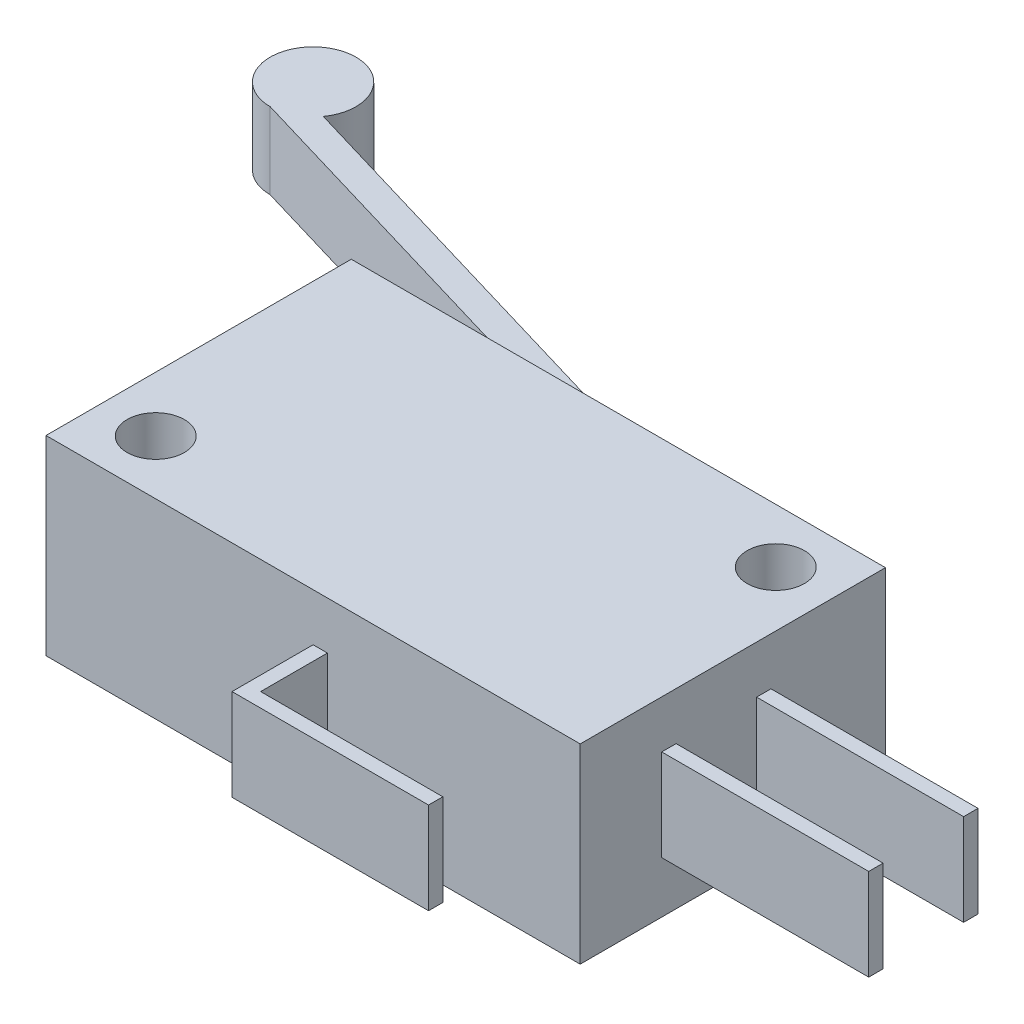
ISO-10303-21;
HEADER;
FILE_DESCRIPTION(('STEP AP214'),'2;1');
FILE_NAME('part.step','',(''),(''),'','','');
FILE_SCHEMA(('AUTOMOTIVE_DESIGN { 1 0 10303 214 1 1 1 1 }'));
ENDSEC;
DATA;
#1=APPLICATION_CONTEXT('core data for automotive mechanical design processes');
#2=APPLICATION_PROTOCOL_DEFINITION('international standard','automotive_design',2000,#1);
#3=PRODUCT_CONTEXT('',#1,'mechanical');
#4=PRODUCT('Part','Part','',(#3));
#5=PRODUCT_RELATED_PRODUCT_CATEGORY('part','',(#4));
#6=PRODUCT_DEFINITION_FORMATION('','',#4);
#7=PRODUCT_DEFINITION_CONTEXT('part definition',#1,'design');
#8=PRODUCT_DEFINITION('design','',#6,#7);
#9=PRODUCT_DEFINITION_SHAPE('','',#8);
#10=(LENGTH_UNIT() NAMED_UNIT(*) SI_UNIT(.MILLI.,.METRE.));
#11=(NAMED_UNIT(*) PLANE_ANGLE_UNIT() SI_UNIT($,.RADIAN.));
#12=(NAMED_UNIT(*) SI_UNIT($,.STERADIAN.) SOLID_ANGLE_UNIT());
#13=UNCERTAINTY_MEASURE_WITH_UNIT(LENGTH_MEASURE(1.E-05),#10,'distance_accuracy_value','');
#14=(GEOMETRIC_REPRESENTATION_CONTEXT(3) GLOBAL_UNCERTAINTY_ASSIGNED_CONTEXT((#13)) GLOBAL_UNIT_ASSIGNED_CONTEXT((#10,
#11,#12)) REPRESENTATION_CONTEXT('',''));
#15=CARTESIAN_POINT('',(0.,0.,0.));
#16=DIRECTION('',(0.,0.,1.));
#17=DIRECTION('',(1.,0.,0.));
#18=AXIS2_PLACEMENT_3D('',#15,#16,#17);
#19=CARTESIAN_POINT('',(0.,10.,0.));
#20=DIRECTION('',(0.,0.,-1.));
#21=DIRECTION('',(-1.,0.,0.));
#22=AXIS2_PLACEMENT_3D('',#19,#20,#21);
#23=PLANE('',#22);
#24=DIRECTION('',(1.,0.,0.));
#25=VECTOR('',#24,1.);
#26=CARTESIAN_POINT('',(0.,0.,0.));
#27=LINE('',#26,#25);
#28=CARTESIAN_POINT('',(0.,0.,0.));
#29=VERTEX_POINT('',#28);
#30=CARTESIAN_POINT('',(28.,0.,0.));
#31=VERTEX_POINT('',#30);
#32=EDGE_CURVE('E489',#29,#31,#27,.T.);
#33=ORIENTED_EDGE('',*,*,#32,.F.);
#34=DIRECTION('',(0.,-1.,0.));
#35=VECTOR('',#34,1.);
#36=CARTESIAN_POINT('',(0.,10.,0.));
#37=LINE('',#36,#35);
#38=CARTESIAN_POINT('',(0.,10.,0.));
#39=VERTEX_POINT('',#38);
#40=EDGE_CURVE('E78',#39,#29,#37,.T.);
#41=ORIENTED_EDGE('',*,*,#40,.F.);
#42=DIRECTION('',(1.,0.,0.));
#43=VECTOR('',#42,1.);
#44=CARTESIAN_POINT('',(0.,10.,0.));
#45=LINE('',#44,#43);
#46=CARTESIAN_POINT('',(28.,10.,0.));
#47=VERTEX_POINT('',#46);
#48=EDGE_CURVE('E472',#39,#47,#45,.T.);
#49=ORIENTED_EDGE('',*,*,#48,.T.);
#50=DIRECTION('',(0.,-1.,0.));
#51=VECTOR('',#50,1.);
#52=CARTESIAN_POINT('',(28.,10.,0.));
#53=LINE('',#52,#51);
#54=EDGE_CURVE('E12',#47,#31,#53,.T.);
#55=ORIENTED_EDGE('',*,*,#54,.T.);
#56=EDGE_LOOP('',(#33,#41,#49,#55));
#57=FACE_BOUND('',#56,.T.);
#58=DIRECTION('',(0.,-1.,0.));
#59=VECTOR('',#58,1.);
#60=CARTESIAN_POINT('',(14.,7.1,0.));
#61=LINE('',#60,#59);
#62=CARTESIAN_POINT('',(14.,7.1,0.));
#63=VERTEX_POINT('',#62);
#64=CARTESIAN_POINT('',(14.,3.1,0.));
#65=VERTEX_POINT('',#64);
#66=EDGE_CURVE('E456',#63,#65,#61,.T.);
#67=ORIENTED_EDGE('',*,*,#66,.T.);
#68=DIRECTION('',(1.,0.,0.));
#69=VECTOR('',#68,1.);
#70=CARTESIAN_POINT('',(0.,3.1,0.));
#71=LINE('',#70,#69);
#72=CARTESIAN_POINT('',(15.43,3.1,0.));
#73=VERTEX_POINT('',#72);
#74=EDGE_CURVE('E415',#65,#73,#71,.T.);
#75=ORIENTED_EDGE('',*,*,#74,.T.);
#76=DIRECTION('',(0.,-1.,0.));
#77=VECTOR('',#76,1.);
#78=CARTESIAN_POINT('',(15.43,7.1,0.));
#79=LINE('',#78,#77);
#80=CARTESIAN_POINT('',(15.43,7.1,0.));
#81=VERTEX_POINT('',#80);
#82=EDGE_CURVE('E453',#81,#73,#79,.T.);
#83=ORIENTED_EDGE('',*,*,#82,.F.);
#84=DIRECTION('',(1.,0.,0.));
#85=VECTOR('',#84,1.);
#86=CARTESIAN_POINT('',(0.,7.1,0.));
#87=LINE('',#86,#85);
#88=EDGE_CURVE('E384',#63,#81,#87,.T.);
#89=ORIENTED_EDGE('',*,*,#88,.F.);
#90=EDGE_LOOP('',(#67,#75,#83,#89));
#91=FACE_BOUND('',#90,.T.);
#92=DIRECTION('',(0.,-1.,0.));
#93=VECTOR('',#92,1.);
#94=CARTESIAN_POINT('',(4.25,7.1,0.));
#95=LINE('',#94,#93);
#96=CARTESIAN_POINT('',(4.25,7.1,0.));
#97=VERTEX_POINT('',#96);
#98=CARTESIAN_POINT('',(4.25,3.1,0.));
#99=VERTEX_POINT('',#98);
#100=EDGE_CURVE('E439',#97,#99,#95,.T.);
#101=ORIENTED_EDGE('',*,*,#100,.T.);
#102=DIRECTION('',(1.,0.,0.));
#103=VECTOR('',#102,1.);
#104=CARTESIAN_POINT('',(0.,3.1,0.));
#105=LINE('',#104,#103);
#106=CARTESIAN_POINT('',(6.81,3.1,0.));
#107=VERTEX_POINT('',#106);
#108=EDGE_CURVE('E381',#99,#107,#105,.T.);
#109=ORIENTED_EDGE('',*,*,#108,.T.);
#110=DIRECTION('',(0.,-1.,0.));
#111=VECTOR('',#110,1.);
#112=CARTESIAN_POINT('',(6.81,7.1,0.));
#113=LINE('',#112,#111);
#114=CARTESIAN_POINT('',(6.81,7.1,0.));
#115=VERTEX_POINT('',#114);
#116=EDGE_CURVE('E409',#115,#107,#113,.T.);
#117=ORIENTED_EDGE('',*,*,#116,.F.);
#118=DIRECTION('',(1.,0.,0.));
#119=VECTOR('',#118,1.);
#120=CARTESIAN_POINT('',(0.,7.1,0.));
#121=LINE('',#120,#119);
#122=EDGE_CURVE('E406',#97,#115,#121,.T.);
#123=ORIENTED_EDGE('',*,*,#122,.F.);
#124=EDGE_LOOP('',(#101,#109,#117,#123));
#125=FACE_BOUND('',#124,.T.);
#126=ADVANCED_FACE('F70',(#57,#91,#125),#23,.T.);
#127=CARTESIAN_POINT('',(28.,10.,0.));
#128=DIRECTION('',(1.,0.,0.));
#129=DIRECTION('',(0.,0.,-1.));
#130=AXIS2_PLACEMENT_3D('',#127,#128,#129);
#131=PLANE('',#130);
#132=DIRECTION('',(0.,0.,1.));
#133=VECTOR('',#132,1.);
#134=CARTESIAN_POINT('',(28.,7.5,0.));
#135=LINE('',#134,#133);
#136=CARTESIAN_POINT('',(28.,7.5,6.));
#137=VERTEX_POINT('',#136);
#138=CARTESIAN_POINT('',(28.,7.5,6.7537410829587));
#139=VERTEX_POINT('',#138);
#140=EDGE_CURVE('E285',#137,#139,#135,.T.);
#141=ORIENTED_EDGE('',*,*,#140,.F.);
#142=DIRECTION('',(0.,-1.,0.));
#143=VECTOR('',#142,1.);
#144=CARTESIAN_POINT('',(28.,7.5,6.));
#145=LINE('',#144,#143);
#146=CARTESIAN_POINT('',(28.,2.7,6.));
#147=VERTEX_POINT('',#146);
#148=EDGE_CURVE('E272',#137,#147,#145,.T.);
#149=ORIENTED_EDGE('',*,*,#148,.T.);
#150=DIRECTION('',(0.,0.,1.));
#151=VECTOR('',#150,1.);
#152=CARTESIAN_POINT('',(28.,2.7,0.));
#153=LINE('',#152,#151);
#154=CARTESIAN_POINT('',(28.,2.7,6.7537410829587));
#155=VERTEX_POINT('',#154);
#156=EDGE_CURVE('E294',#147,#155,#153,.T.);
#157=ORIENTED_EDGE('',*,*,#156,.T.);
#158=DIRECTION('',(0.,-1.,0.));
#159=VECTOR('',#158,1.);
#160=CARTESIAN_POINT('',(28.,7.5,6.7537410829587));
#161=LINE('',#160,#159);
#162=EDGE_CURVE('E299',#139,#155,#161,.T.);
#163=ORIENTED_EDGE('',*,*,#162,.F.);
#164=EDGE_LOOP('',(#141,#149,#157,#163));
#165=FACE_BOUND('',#164,.T.);
#166=DIRECTION('',(0.,0.,1.));
#167=VECTOR('',#166,1.);
#168=CARTESIAN_POINT('',(28.,7.5,0.));
#169=LINE('',#168,#167);
#170=CARTESIAN_POINT('',(28.,7.5,10.9737410829587));
#171=VERTEX_POINT('',#170);
#172=CARTESIAN_POINT('',(28.,7.5,11.7274821659174));
#173=VERTEX_POINT('',#172);
#174=EDGE_CURVE('E308',#171,#173,#169,.T.);
#175=ORIENTED_EDGE('',*,*,#174,.F.);
#176=DIRECTION('',(0.,-1.,0.));
#177=VECTOR('',#176,1.);
#178=CARTESIAN_POINT('',(28.,7.5,10.9737410829587));
#179=LINE('',#178,#177);
#180=CARTESIAN_POINT('',(28.,2.7,10.9737410829587));
#181=VERTEX_POINT('',#180);
#182=EDGE_CURVE('E324',#171,#181,#179,.T.);
#183=ORIENTED_EDGE('',*,*,#182,.T.);
#184=DIRECTION('',(0.,0.,1.));
#185=VECTOR('',#184,1.);
#186=CARTESIAN_POINT('',(28.,2.7,0.));
#187=LINE('',#186,#185);
#188=CARTESIAN_POINT('',(28.,2.7,11.7274821659174));
#189=VERTEX_POINT('',#188);
#190=EDGE_CURVE('E317',#181,#189,#187,.T.);
#191=ORIENTED_EDGE('',*,*,#190,.T.);
#192=DIRECTION('',(0.,-1.,0.));
#193=VECTOR('',#192,1.);
#194=CARTESIAN_POINT('',(28.,7.5,11.7274821659174));
#195=LINE('',#194,#193);
#196=EDGE_CURVE('E322',#173,#189,#195,.T.);
#197=ORIENTED_EDGE('',*,*,#196,.F.);
#198=EDGE_LOOP('',(#175,#183,#191,#197));
#199=FACE_BOUND('',#198,.T.);
#200=DIRECTION('',(0.,0.,1.));
#201=VECTOR('',#200,1.);
#202=CARTESIAN_POINT('',(28.,0.,0.));
#203=LINE('',#202,#201);
#204=CARTESIAN_POINT('',(28.,0.,16.));
#205=VERTEX_POINT('',#204);
#206=EDGE_CURVE('E486',#31,#205,#203,.T.);
#207=ORIENTED_EDGE('',*,*,#206,.F.);
#208=ORIENTED_EDGE('',*,*,#54,.F.);
#209=DIRECTION('',(0.,0.,1.));
#210=VECTOR('',#209,1.);
#211=CARTESIAN_POINT('',(28.,10.,0.));
#212=LINE('',#211,#210);
#213=CARTESIAN_POINT('',(28.,10.,16.));
#214=VERTEX_POINT('',#213);
#215=EDGE_CURVE('E469',#47,#214,#212,.T.);
#216=ORIENTED_EDGE('',*,*,#215,.T.);
#217=DIRECTION('',(0.,-1.,0.));
#218=VECTOR('',#217,1.);
#219=CARTESIAN_POINT('',(28.,10.,16.));
#220=LINE('',#219,#218);
#221=EDGE_CURVE('E480',#214,#205,#220,.T.);
#222=ORIENTED_EDGE('',*,*,#221,.T.);
#223=EDGE_LOOP('',(#207,#208,#216,#222));
#224=FACE_BOUND('',#223,.T.);
#225=ADVANCED_FACE('F514',(#165,#199,#224),#131,.T.);
#226=CARTESIAN_POINT('',(0.,10.,0.));
#227=DIRECTION('',(1.,0.,0.));
#228=DIRECTION('',(0.,0.,-1.));
#229=AXIS2_PLACEMENT_3D('',#226,#227,#228);
#230=PLANE('',#229);
#231=DIRECTION('',(0.,0.,1.));
#232=VECTOR('',#231,1.);
#233=CARTESIAN_POINT('',(0.,0.,0.));
#234=LINE('',#233,#232);
#235=CARTESIAN_POINT('',(0.,0.,16.));
#236=VERTEX_POINT('',#235);
#237=EDGE_CURVE('E492',#29,#236,#234,.T.);
#238=ORIENTED_EDGE('',*,*,#237,.T.);
#239=DIRECTION('',(0.,-1.,0.));
#240=VECTOR('',#239,1.);
#241=CARTESIAN_POINT('',(0.,10.,16.));
#242=LINE('',#241,#240);
#243=CARTESIAN_POINT('',(0.,10.,16.));
#244=VERTEX_POINT('',#243);
#245=EDGE_CURVE('E498',#244,#236,#242,.T.);
#246=ORIENTED_EDGE('',*,*,#245,.F.);
#247=DIRECTION('',(0.,0.,1.));
#248=VECTOR('',#247,1.);
#249=CARTESIAN_POINT('',(0.,10.,0.));
#250=LINE('',#249,#248);
#251=EDGE_CURVE('E475',#39,#244,#250,.T.);
#252=ORIENTED_EDGE('',*,*,#251,.F.);
#253=ORIENTED_EDGE('',*,*,#40,.T.);
#254=EDGE_LOOP('',(#238,#246,#252,#253));
#255=FACE_BOUND('',#254,.T.);
#256=ADVANCED_FACE('F503',(#255),#230,.F.);
#257=CARTESIAN_POINT('',(2.9,10.,13.15));
#258=DIRECTION('',(0.,-1.,0.));
#259=DIRECTION('',(0.,0.,-1.));
#260=AXIS2_PLACEMENT_3D('',#257,#258,#259);
#261=CYLINDRICAL_SURFACE('',#260,1.5);
#262=CARTESIAN_POINT('',(2.9,10.,13.15));
#263=DIRECTION('',(0.,1.,0.));
#264=DIRECTION('',(0.,0.,1.));
#265=AXIS2_PLACEMENT_3D('',#262,#263,#264);
#266=CIRCLE('',#265,1.5);
#267=CARTESIAN_POINT('',(2.9,10.,14.65));
#268=VERTEX_POINT('',#267);
#269=EDGE_CURVE('E465',#268,#268,#266,.T.);
#270=ORIENTED_EDGE('',*,*,#269,.T.);
#271=EDGE_LOOP('',(#270));
#272=FACE_BOUND('',#271,.T.);
#273=CARTESIAN_POINT('',(2.9,0.,13.15));
#274=DIRECTION('',(0.,1.,0.));
#275=DIRECTION('',(0.,0.,1.));
#276=AXIS2_PLACEMENT_3D('',#273,#274,#275);
#277=CIRCLE('',#276,1.5);
#278=CARTESIAN_POINT('',(2.9,0.,14.65));
#279=VERTEX_POINT('',#278);
#280=EDGE_CURVE('E483',#279,#279,#277,.T.);
#281=ORIENTED_EDGE('',*,*,#280,.F.);
#282=EDGE_LOOP('',(#281));
#283=FACE_BOUND('',#282,.T.);
#284=ADVANCED_FACE('F544',(#272,#283),#261,.F.);
#285=CARTESIAN_POINT('',(25.1,10.,2.85));
#286=DIRECTION('',(0.,-1.,0.));
#287=DIRECTION('',(0.,0.,-1.));
#288=AXIS2_PLACEMENT_3D('',#285,#286,#287);
#289=CYLINDRICAL_SURFACE('',#288,1.5);
#290=CARTESIAN_POINT('',(25.1,10.,2.85));
#291=DIRECTION('',(0.,1.,0.));
#292=DIRECTION('',(0.,0.,1.));
#293=AXIS2_PLACEMENT_3D('',#290,#291,#292);
#294=CIRCLE('',#293,1.5);
#295=CARTESIAN_POINT('',(25.1,10.,4.35));
#296=VERTEX_POINT('',#295);
#297=EDGE_CURVE('E462',#296,#296,#294,.T.);
#298=ORIENTED_EDGE('',*,*,#297,.T.);
#299=EDGE_LOOP('',(#298));
#300=FACE_BOUND('',#299,.T.);
#301=CARTESIAN_POINT('',(25.1,0.,2.85));
#302=DIRECTION('',(0.,1.,0.));
#303=DIRECTION('',(0.,0.,1.));
#304=AXIS2_PLACEMENT_3D('',#301,#302,#303);
#305=CIRCLE('',#304,1.5);
#306=CARTESIAN_POINT('',(25.1,0.,4.35));
#307=VERTEX_POINT('',#306);
#308=EDGE_CURVE('E461',#307,#307,#305,.T.);
#309=ORIENTED_EDGE('',*,*,#308,.F.);
#310=EDGE_LOOP('',(#309));
#311=FACE_BOUND('',#310,.T.);
#312=ADVANCED_FACE('F72',(#300,#311),#289,.F.);
#313=CARTESIAN_POINT('',(0.,10.,16.));
#314=DIRECTION('',(0.,0.,-1.));
#315=DIRECTION('',(-1.,0.,0.));
#316=AXIS2_PLACEMENT_3D('',#313,#314,#315);
#317=PLANE('',#316);
#318=DIRECTION('',(0.,-1.,0.));
#319=VECTOR('',#318,1.);
#320=CARTESIAN_POINT('',(14.,7.5,16.));
#321=LINE('',#320,#319);
#322=CARTESIAN_POINT('',(14.,7.5,16.));
#323=VERTEX_POINT('',#322);
#324=CARTESIAN_POINT('',(14.,2.7,16.));
#325=VERTEX_POINT('',#324);
#326=EDGE_CURVE('E369',#323,#325,#321,.T.);
#327=ORIENTED_EDGE('',*,*,#326,.F.);
#328=DIRECTION('',(1.,0.,0.));
#329=VECTOR('',#328,1.);
#330=CARTESIAN_POINT('',(0.,7.5,16.));
#331=LINE('',#330,#329);
#332=CARTESIAN_POINT('',(14.75,7.5,16.));
#333=VERTEX_POINT('',#332);
#334=EDGE_CURVE('E337',#323,#333,#331,.T.);
#335=ORIENTED_EDGE('',*,*,#334,.T.);
#336=DIRECTION('',(0.,-1.,0.));
#337=VECTOR('',#336,1.);
#338=CARTESIAN_POINT('',(14.75,7.5,16.));
#339=LINE('',#338,#337);
#340=CARTESIAN_POINT('',(14.75,2.7,16.));
#341=VERTEX_POINT('',#340);
#342=EDGE_CURVE('E372',#333,#341,#339,.T.);
#343=ORIENTED_EDGE('',*,*,#342,.T.);
#344=DIRECTION('',(1.,0.,0.));
#345=VECTOR('',#344,1.);
#346=CARTESIAN_POINT('',(0.,2.7,16.));
#347=LINE('',#346,#345);
#348=EDGE_CURVE('E353',#325,#341,#347,.T.);
#349=ORIENTED_EDGE('',*,*,#348,.F.);
#350=EDGE_LOOP('',(#327,#335,#343,#349));
#351=FACE_BOUND('',#350,.T.);
#352=DIRECTION('',(1.,0.,0.));
#353=VECTOR('',#352,1.);
#354=CARTESIAN_POINT('',(0.,0.,16.));
#355=LINE('',#354,#353);
#356=EDGE_CURVE('E466',#236,#205,#355,.T.);
#357=ORIENTED_EDGE('',*,*,#356,.T.);
#358=ORIENTED_EDGE('',*,*,#221,.F.);
#359=DIRECTION('',(1.,0.,0.));
#360=VECTOR('',#359,1.);
#361=CARTESIAN_POINT('',(0.,10.,16.));
#362=LINE('',#361,#360);
#363=EDGE_CURVE('E478',#244,#214,#362,.T.);
#364=ORIENTED_EDGE('',*,*,#363,.F.);
#365=ORIENTED_EDGE('',*,*,#245,.T.);
#366=EDGE_LOOP('',(#357,#358,#364,#365));
#367=FACE_BOUND('',#366,.T.);
#368=ADVANCED_FACE('F517',(#351,#367),#317,.F.);
#369=CARTESIAN_POINT('',(0.,10.,0.));
#370=DIRECTION('',(0.,1.,0.));
#371=DIRECTION('',(0.,0.,1.));
#372=AXIS2_PLACEMENT_3D('',#369,#370,#371);
#373=PLANE('',#372);
#374=ORIENTED_EDGE('',*,*,#297,.F.);
#375=EDGE_LOOP('',(#374));
#376=FACE_BOUND('',#375,.T.);
#377=ORIENTED_EDGE('',*,*,#269,.F.);
#378=EDGE_LOOP('',(#377));
#379=FACE_BOUND('',#378,.T.);
#380=ORIENTED_EDGE('',*,*,#215,.F.);
#381=ORIENTED_EDGE('',*,*,#48,.F.);
#382=ORIENTED_EDGE('',*,*,#251,.T.);
#383=ORIENTED_EDGE('',*,*,#363,.T.);
#384=EDGE_LOOP('',(#380,#381,#382,#383));
#385=FACE_BOUND('',#384,.T.);
#386=ADVANCED_FACE('F519',(#376,#379,#385),#373,.T.);
#387=CARTESIAN_POINT('',(0.,0.,0.));
#388=DIRECTION('',(0.,1.,0.));
#389=DIRECTION('',(0.,0.,1.));
#390=AXIS2_PLACEMENT_3D('',#387,#388,#389);
#391=PLANE('',#390);
#392=ORIENTED_EDGE('',*,*,#308,.T.);
#393=EDGE_LOOP('',(#392));
#394=FACE_BOUND('',#393,.T.);
#395=ORIENTED_EDGE('',*,*,#280,.T.);
#396=EDGE_LOOP('',(#395));
#397=FACE_BOUND('',#396,.T.);
#398=ORIENTED_EDGE('',*,*,#206,.T.);
#399=ORIENTED_EDGE('',*,*,#356,.F.);
#400=ORIENTED_EDGE('',*,*,#237,.F.);
#401=ORIENTED_EDGE('',*,*,#32,.T.);
#402=EDGE_LOOP('',(#398,#399,#400,#401));
#403=FACE_BOUND('',#402,.T.);
#404=ADVANCED_FACE('F509',(#394,#397,#403),#391,.F.);
#405=CARTESIAN_POINT('',(-11.95,7.1,-9.95));
#406=DIRECTION('',(0.,-1.,0.));
#407=DIRECTION('',(0.,0.,-1.));
#408=AXIS2_PLACEMENT_3D('',#405,#406,#407);
#409=CYLINDRICAL_SURFACE('',#408,2.25);
#410=CARTESIAN_POINT('',(-11.95,3.1,-9.95));
#411=DIRECTION('',(0.,1.,0.));
#412=DIRECTION('',(0.,0.,1.));
#413=AXIS2_PLACEMENT_3D('',#410,#411,#412);
#414=CIRCLE('',#413,2.25);
#415=CARTESIAN_POINT('',(-10.1140022550485,3.1,-8.64938003992973));
#416=VERTEX_POINT('',#415);
#417=CARTESIAN_POINT('',(-11.95,3.1,-7.7));
#418=VERTEX_POINT('',#417);
#419=EDGE_CURVE('E427',#416,#418,#414,.T.);
#420=ORIENTED_EDGE('',*,*,#419,.T.);
#421=DIRECTION('',(0.,-1.,0.));
#422=VECTOR('',#421,1.);
#423=CARTESIAN_POINT('',(-11.95,7.1,-7.7));
#424=LINE('',#423,#422);
#425=CARTESIAN_POINT('',(-11.95,7.1,-7.7));
#426=VERTEX_POINT('',#425);
#427=EDGE_CURVE('E445',#426,#418,#424,.T.);
#428=ORIENTED_EDGE('',*,*,#427,.F.);
#429=CARTESIAN_POINT('',(-11.95,7.1,-9.95));
#430=DIRECTION('',(0.,1.,0.));
#431=DIRECTION('',(0.,0.,1.));
#432=AXIS2_PLACEMENT_3D('',#429,#430,#431);
#433=CIRCLE('',#432,2.25);
#434=CARTESIAN_POINT('',(-10.1140022550485,7.1,-8.64938003992973));
#435=VERTEX_POINT('',#434);
#436=EDGE_CURVE('E397',#435,#426,#433,.T.);
#437=ORIENTED_EDGE('',*,*,#436,.F.);
#438=DIRECTION('',(0.,-1.,0.));
#439=VECTOR('',#438,1.);
#440=CARTESIAN_POINT('',(-10.1140022550485,7.1,-8.64938003992973));
#441=LINE('',#440,#439);
#442=EDGE_CURVE('E447',#435,#416,#441,.T.);
#443=ORIENTED_EDGE('',*,*,#442,.T.);
#444=EDGE_LOOP('',(#420,#428,#437,#443));
#445=FACE_BOUND('',#444,.T.);
#446=ADVANCED_FACE('F527',(#445),#409,.T.);
#447=CARTESIAN_POINT('',(1.13288999136746,7.1,-3.81798639947863));
#448=DIRECTION('',(0.284465663427247,0.,-0.958686229342477));
#449=DIRECTION('',(-0.958686229342477,0.,-0.284465663427247));
#450=AXIS2_PLACEMENT_3D('',#447,#448,#449);
#451=PLANE('',#450);
#452=DIRECTION('',(0.958686229342477,0.,0.284465663427247));
#453=VECTOR('',#452,1.);
#454=CARTESIAN_POINT('',(1.13288999136746,3.1,-3.81798639947863));
#455=LINE('',#454,#453);
#456=CARTESIAN_POINT('',(6.2487012987013,3.1,-2.3));
#457=VERTEX_POINT('',#456);
#458=EDGE_CURVE('E416',#418,#457,#455,.T.);
#459=ORIENTED_EDGE('',*,*,#458,.T.);
#460=DIRECTION('',(0.,-1.,0.));
#461=VECTOR('',#460,1.);
#462=CARTESIAN_POINT('',(6.2487012987013,7.1,-2.3));
#463=LINE('',#462,#461);
#464=CARTESIAN_POINT('',(6.2487012987013,7.1,-2.3));
#465=VERTEX_POINT('',#464);
#466=EDGE_CURVE('E443',#465,#457,#463,.T.);
#467=ORIENTED_EDGE('',*,*,#466,.F.);
#468=DIRECTION('',(0.958686229342477,0.,0.284465663427247));
#469=VECTOR('',#468,1.);
#470=CARTESIAN_POINT('',(1.13288999136746,7.1,-3.81798639947863));
#471=LINE('',#470,#469);
#472=EDGE_CURVE('E385',#426,#465,#471,.T.);
#473=ORIENTED_EDGE('',*,*,#472,.F.);
#474=ORIENTED_EDGE('',*,*,#427,.T.);
#475=EDGE_LOOP('',(#459,#467,#473,#474));
#476=FACE_BOUND('',#475,.T.);
#477=ADVANCED_FACE('F530',(#476),#451,.F.);
#478=CARTESIAN_POINT('',(0.,7.1,-2.3));
#479=DIRECTION('',(0.,0.,-1.));
#480=DIRECTION('',(-1.,0.,0.));
#481=AXIS2_PLACEMENT_3D('',#478,#479,#480);
#482=PLANE('',#481);
#483=DIRECTION('',(1.,0.,0.));
#484=VECTOR('',#483,1.);
#485=CARTESIAN_POINT('',(0.,3.1,-2.3));
#486=LINE('',#485,#484);
#487=CARTESIAN_POINT('',(4.25,3.1,-2.3));
#488=VERTEX_POINT('',#487);
#489=EDGE_CURVE('E430',#488,#457,#486,.T.);
#490=ORIENTED_EDGE('',*,*,#489,.F.);
#491=DIRECTION('',(0.,-1.,0.));
#492=VECTOR('',#491,1.);
#493=CARTESIAN_POINT('',(4.25,7.1,-2.3));
#494=LINE('',#493,#492);
#495=CARTESIAN_POINT('',(4.25,7.1,-2.3));
#496=VERTEX_POINT('',#495);
#497=EDGE_CURVE('E441',#496,#488,#494,.T.);
#498=ORIENTED_EDGE('',*,*,#497,.F.);
#499=DIRECTION('',(1.,0.,0.));
#500=VECTOR('',#499,1.);
#501=CARTESIAN_POINT('',(0.,7.1,-2.3));
#502=LINE('',#501,#500);
#503=EDGE_CURVE('E400',#496,#465,#502,.T.);
#504=ORIENTED_EDGE('',*,*,#503,.T.);
#505=ORIENTED_EDGE('',*,*,#466,.T.);
#506=EDGE_LOOP('',(#490,#498,#504,#505));
#507=FACE_BOUND('',#506,.T.);
#508=ADVANCED_FACE('F755',(#507),#482,.T.);
#509=CARTESIAN_POINT('',(4.25,7.1,0.));
#510=DIRECTION('',(-1.,0.,0.));
#511=DIRECTION('',(0.,0.,1.));
#512=AXIS2_PLACEMENT_3D('',#509,#510,#511);
#513=PLANE('',#512);
#514=DIRECTION('',(0.,0.,-1.));
#515=VECTOR('',#514,1.);
#516=CARTESIAN_POINT('',(4.25,3.1,0.));
#517=LINE('',#516,#515);
#518=EDGE_CURVE('E433',#99,#488,#517,.T.);
#519=ORIENTED_EDGE('',*,*,#518,.F.);
#520=ORIENTED_EDGE('',*,*,#100,.F.);
#521=DIRECTION('',(0.,0.,-1.));
#522=VECTOR('',#521,1.);
#523=CARTESIAN_POINT('',(4.25,7.1,0.));
#524=LINE('',#523,#522);
#525=EDGE_CURVE('E403',#97,#496,#524,.T.);
#526=ORIENTED_EDGE('',*,*,#525,.T.);
#527=ORIENTED_EDGE('',*,*,#497,.T.);
#528=EDGE_LOOP('',(#519,#520,#526,#527));
#529=FACE_BOUND('',#528,.T.);
#530=ADVANCED_FACE('F751',(#529),#513,.T.);
#531=CARTESIAN_POINT('',(6.81,7.1,0.));
#532=DIRECTION('',(-1.,0.,0.));
#533=DIRECTION('',(0.,0.,1.));
#534=AXIS2_PLACEMENT_3D('',#531,#532,#533);
#535=PLANE('',#534);
#536=DIRECTION('',(0.,0.,-1.));
#537=VECTOR('',#536,1.);
#538=CARTESIAN_POINT('',(6.81,3.1,0.));
#539=LINE('',#538,#537);
#540=CARTESIAN_POINT('',(6.81,3.1,-2.13344894026975));
#541=VERTEX_POINT('',#540);
#542=EDGE_CURVE('E376',#107,#541,#539,.T.);
#543=ORIENTED_EDGE('',*,*,#542,.T.);
#544=DIRECTION('',(0.,-1.,0.));
#545=VECTOR('',#544,1.);
#546=CARTESIAN_POINT('',(6.81,7.1,-2.13344894026975));
#547=LINE('',#546,#545);
#548=CARTESIAN_POINT('',(6.81,7.1,-2.13344894026975));
#549=VERTEX_POINT('',#548);
#550=EDGE_CURVE('E458',#549,#541,#547,.T.);
#551=ORIENTED_EDGE('',*,*,#550,.F.);
#552=DIRECTION('',(0.,0.,-1.));
#553=VECTOR('',#552,1.);
#554=CARTESIAN_POINT('',(6.81,7.1,0.));
#555=LINE('',#554,#553);
#556=EDGE_CURVE('E377',#115,#549,#555,.T.);
#557=ORIENTED_EDGE('',*,*,#556,.F.);
#558=ORIENTED_EDGE('',*,*,#116,.T.);
#559=EDGE_LOOP('',(#543,#551,#557,#558));
#560=FACE_BOUND('',#559,.T.);
#561=ADVANCED_FACE('F754',(#560),#535,.F.);
#562=EDGE_CURVE('E412',#541,#65,#455,.T.);
#563=ORIENTED_EDGE('',*,*,#562,.T.);
#564=ORIENTED_EDGE('',*,*,#66,.F.);
#565=EDGE_CURVE('E380',#549,#63,#471,.T.);
#566=ORIENTED_EDGE('',*,*,#565,.F.);
#567=ORIENTED_EDGE('',*,*,#550,.T.);
#568=EDGE_LOOP('',(#563,#564,#566,#567));
#569=FACE_BOUND('',#568,.T.);
#570=ADVANCED_FACE('F763',(#569),#451,.F.);
#571=CARTESIAN_POINT('',(15.43,7.1,0.));
#572=DIRECTION('',(1.,0.,0.));
#573=DIRECTION('',(0.,0.,-1.));
#574=AXIS2_PLACEMENT_3D('',#571,#572,#573);
#575=PLANE('',#574);
#576=DIRECTION('',(0.,0.,1.));
#577=VECTOR('',#576,1.);
#578=CARTESIAN_POINT('',(15.43,3.1,0.));
#579=LINE('',#578,#577);
#580=CARTESIAN_POINT('',(15.43,3.1,-1.49416549796928));
#581=VERTEX_POINT('',#580);
#582=EDGE_CURVE('E418',#581,#73,#579,.T.);
#583=ORIENTED_EDGE('',*,*,#582,.F.);
#584=DIRECTION('',(0.,-1.,0.));
#585=VECTOR('',#584,1.);
#586=CARTESIAN_POINT('',(15.43,7.1,-1.49416549796928));
#587=LINE('',#586,#585);
#588=CARTESIAN_POINT('',(15.43,7.1,-1.49416549796928));
#589=VERTEX_POINT('',#588);
#590=EDGE_CURVE('E451',#589,#581,#587,.T.);
#591=ORIENTED_EDGE('',*,*,#590,.F.);
#592=DIRECTION('',(0.,0.,1.));
#593=VECTOR('',#592,1.);
#594=CARTESIAN_POINT('',(15.43,7.1,0.));
#595=LINE('',#594,#593);
#596=EDGE_CURVE('E388',#589,#81,#595,.T.);
#597=ORIENTED_EDGE('',*,*,#596,.T.);
#598=ORIENTED_EDGE('',*,*,#82,.T.);
#599=EDGE_LOOP('',(#583,#591,#597,#598));
#600=FACE_BOUND('',#599,.T.);
#601=ADVANCED_FACE('F773',(#600),#575,.T.);
#602=CARTESIAN_POINT('',(0.,7.1,-1.49416549796927));
#603=DIRECTION('',(0.,0.,-1.));
#604=DIRECTION('',(-1.,0.,0.));
#605=AXIS2_PLACEMENT_3D('',#602,#603,#604);
#606=PLANE('',#605);
#607=DIRECTION('',(1.,0.,0.));
#608=VECTOR('',#607,1.);
#609=CARTESIAN_POINT('',(0.,3.1,-1.49416549796927));
#610=LINE('',#609,#608);
#611=CARTESIAN_POINT('',(14.,3.1,-1.49416549796928));
#612=VERTEX_POINT('',#611);
#613=EDGE_CURVE('E421',#612,#581,#610,.T.);
#614=ORIENTED_EDGE('',*,*,#613,.F.);
#615=DIRECTION('',(0.,-1.,0.));
#616=VECTOR('',#615,1.);
#617=CARTESIAN_POINT('',(14.,7.1,-1.49416549796928));
#618=LINE('',#617,#616);
#619=CARTESIAN_POINT('',(14.,7.1,-1.49416549796928));
#620=VERTEX_POINT('',#619);
#621=EDGE_CURVE('E449',#620,#612,#618,.T.);
#622=ORIENTED_EDGE('',*,*,#621,.F.);
#623=DIRECTION('',(1.,0.,0.));
#624=VECTOR('',#623,1.);
#625=CARTESIAN_POINT('',(0.,7.1,-1.49416549796927));
#626=LINE('',#625,#624);
#627=EDGE_CURVE('E391',#620,#589,#626,.T.);
#628=ORIENTED_EDGE('',*,*,#627,.T.);
#629=ORIENTED_EDGE('',*,*,#590,.T.);
#630=EDGE_LOOP('',(#614,#622,#628,#629));
#631=FACE_BOUND('',#630,.T.);
#632=ADVANCED_FACE('F769',(#631),#606,.T.);
#633=CARTESIAN_POINT('',(1.54036881635438,7.1,-5.19124295901249));
#634=DIRECTION('',(0.284465663427247,0.,-0.958686229342477));
#635=DIRECTION('',(-0.958686229342477,0.,-0.284465663427247));
#636=AXIS2_PLACEMENT_3D('',#633,#634,#635);
#637=PLANE('',#636);
#638=DIRECTION('',(0.958686229342477,0.,0.284465663427247));
#639=VECTOR('',#638,1.);
#640=CARTESIAN_POINT('',(1.54036881635438,3.1,-5.19124295901249));
#641=LINE('',#640,#639);
#642=EDGE_CURVE('E424',#416,#612,#641,.T.);
#643=ORIENTED_EDGE('',*,*,#642,.F.);
#644=ORIENTED_EDGE('',*,*,#442,.F.);
#645=DIRECTION('',(0.958686229342477,0.,0.284465663427247));
#646=VECTOR('',#645,1.);
#647=CARTESIAN_POINT('',(1.54036881635438,7.1,-5.19124295901249));
#648=LINE('',#647,#646);
#649=EDGE_CURVE('E394',#435,#620,#648,.T.);
#650=ORIENTED_EDGE('',*,*,#649,.T.);
#651=ORIENTED_EDGE('',*,*,#621,.T.);
#652=EDGE_LOOP('',(#643,#644,#650,#651));
#653=FACE_BOUND('',#652,.T.);
#654=ADVANCED_FACE('F749',(#653),#637,.T.);
#655=CARTESIAN_POINT('',(0.,3.1,0.));
#656=DIRECTION('',(0.,1.,0.));
#657=DIRECTION('',(0.,0.,1.));
#658=AXIS2_PLACEMENT_3D('',#655,#656,#657);
#659=PLANE('',#658);
#660=ORIENTED_EDGE('',*,*,#458,.F.);
#661=ORIENTED_EDGE('',*,*,#419,.F.);
#662=ORIENTED_EDGE('',*,*,#642,.T.);
#663=ORIENTED_EDGE('',*,*,#613,.T.);
#664=ORIENTED_EDGE('',*,*,#582,.T.);
#665=ORIENTED_EDGE('',*,*,#74,.F.);
#666=ORIENTED_EDGE('',*,*,#562,.F.);
#667=ORIENTED_EDGE('',*,*,#542,.F.);
#668=ORIENTED_EDGE('',*,*,#108,.F.);
#669=ORIENTED_EDGE('',*,*,#518,.T.);
#670=ORIENTED_EDGE('',*,*,#489,.T.);
#671=EDGE_LOOP('',(#660,#661,#662,#663,#664,#665,#666,#667,#668,#669,#670));
#672=FACE_BOUND('',#671,.T.);
#673=ADVANCED_FACE('F745',(#672),#659,.F.);
#674=CARTESIAN_POINT('',(0.,7.1,0.));
#675=DIRECTION('',(0.,1.,0.));
#676=DIRECTION('',(0.,0.,1.));
#677=AXIS2_PLACEMENT_3D('',#674,#675,#676);
#678=PLANE('',#677);
#679=ORIENTED_EDGE('',*,*,#649,.F.);
#680=ORIENTED_EDGE('',*,*,#436,.T.);
#681=ORIENTED_EDGE('',*,*,#472,.T.);
#682=ORIENTED_EDGE('',*,*,#503,.F.);
#683=ORIENTED_EDGE('',*,*,#525,.F.);
#684=ORIENTED_EDGE('',*,*,#122,.T.);
#685=ORIENTED_EDGE('',*,*,#556,.T.);
#686=ORIENTED_EDGE('',*,*,#565,.T.);
#687=ORIENTED_EDGE('',*,*,#88,.T.);
#688=ORIENTED_EDGE('',*,*,#596,.F.);
#689=ORIENTED_EDGE('',*,*,#627,.F.);
#690=EDGE_LOOP('',(#679,#680,#681,#682,#683,#684,#685,#686,#687,#688,#689));
#691=FACE_BOUND('',#690,.T.);
#692=ADVANCED_FACE('F569',(#691),#678,.T.);
#693=CARTESIAN_POINT('',(0.,7.5,19.5));
#694=DIRECTION('',(0.,0.,-1.));
#695=DIRECTION('',(-1.,0.,0.));
#696=AXIS2_PLACEMENT_3D('',#693,#694,#695);
#697=PLANE('',#696);
#698=DIRECTION('',(1.,0.,0.));
#699=VECTOR('',#698,1.);
#700=CARTESIAN_POINT('',(0.,2.7,19.5));
#701=LINE('',#700,#699);
#702=CARTESIAN_POINT('',(14.75,2.7,19.5));
#703=VERTEX_POINT('',#702);
#704=CARTESIAN_POINT('',(24.3,2.7,19.5));
#705=VERTEX_POINT('',#704);
#706=EDGE_CURVE('E329',#703,#705,#701,.T.);
#707=ORIENTED_EDGE('',*,*,#706,.F.);
#708=DIRECTION('',(0.,-1.,0.));
#709=VECTOR('',#708,1.);
#710=CARTESIAN_POINT('',(14.75,7.5,19.5));
#711=LINE('',#710,#709);
#712=CARTESIAN_POINT('',(14.75,7.5,19.5));
#713=VERTEX_POINT('',#712);
#714=EDGE_CURVE('E374',#713,#703,#711,.T.);
#715=ORIENTED_EDGE('',*,*,#714,.F.);
#716=DIRECTION('',(1.,0.,0.));
#717=VECTOR('',#716,1.);
#718=CARTESIAN_POINT('',(0.,7.5,19.5));
#719=LINE('',#718,#717);
#720=CARTESIAN_POINT('',(24.3,7.5,19.5));
#721=VERTEX_POINT('',#720);
#722=EDGE_CURVE('E330',#713,#721,#719,.T.);
#723=ORIENTED_EDGE('',*,*,#722,.T.);
#724=DIRECTION('',(0.,-1.,0.));
#725=VECTOR('',#724,1.);
#726=CARTESIAN_POINT('',(24.3,7.5,19.5));
#727=LINE('',#726,#725);
#728=EDGE_CURVE('E347',#721,#705,#727,.T.);
#729=ORIENTED_EDGE('',*,*,#728,.T.);
#730=EDGE_LOOP('',(#707,#715,#723,#729));
#731=FACE_BOUND('',#730,.T.);
#732=ADVANCED_FACE('F582',(#731),#697,.T.);
#733=CARTESIAN_POINT('',(14.75,7.5,0.));
#734=DIRECTION('',(-1.,0.,0.));
#735=DIRECTION('',(0.,0.,1.));
#736=AXIS2_PLACEMENT_3D('',#733,#734,#735);
#737=PLANE('',#736);
#738=DIRECTION('',(0.,0.,-1.));
#739=VECTOR('',#738,1.);
#740=CARTESIAN_POINT('',(14.75,2.7,0.));
#741=LINE('',#740,#739);
#742=EDGE_CURVE('E350',#703,#341,#741,.T.);
#743=ORIENTED_EDGE('',*,*,#742,.T.);
#744=ORIENTED_EDGE('',*,*,#342,.F.);
#745=DIRECTION('',(0.,0.,-1.));
#746=VECTOR('',#745,1.);
#747=CARTESIAN_POINT('',(14.75,7.5,0.));
#748=LINE('',#747,#746);
#749=EDGE_CURVE('E333',#713,#333,#748,.T.);
#750=ORIENTED_EDGE('',*,*,#749,.F.);
#751=ORIENTED_EDGE('',*,*,#714,.T.);
#752=EDGE_LOOP('',(#743,#744,#750,#751));
#753=FACE_BOUND('',#752,.T.);
#754=ADVANCED_FACE('F587',(#753),#737,.F.);
#755=CARTESIAN_POINT('',(14.,7.5,0.));
#756=DIRECTION('',(-1.,0.,0.));
#757=DIRECTION('',(0.,0.,1.));
#758=AXIS2_PLACEMENT_3D('',#755,#756,#757);
#759=PLANE('',#758);
#760=DIRECTION('',(0.,0.,-1.));
#761=VECTOR('',#760,1.);
#762=CARTESIAN_POINT('',(14.,2.7,0.));
#763=LINE('',#762,#761);
#764=CARTESIAN_POINT('',(14.,2.7,20.25));
#765=VERTEX_POINT('',#764);
#766=EDGE_CURVE('E356',#765,#325,#763,.T.);
#767=ORIENTED_EDGE('',*,*,#766,.F.);
#768=DIRECTION('',(0.,-1.,0.));
#769=VECTOR('',#768,1.);
#770=CARTESIAN_POINT('',(14.,7.5,20.25));
#771=LINE('',#770,#769);
#772=CARTESIAN_POINT('',(14.,7.5,20.25));
#773=VERTEX_POINT('',#772);
#774=EDGE_CURVE('E367',#773,#765,#771,.T.);
#775=ORIENTED_EDGE('',*,*,#774,.F.);
#776=DIRECTION('',(0.,0.,-1.));
#777=VECTOR('',#776,1.);
#778=CARTESIAN_POINT('',(14.,7.5,0.));
#779=LINE('',#778,#777);
#780=EDGE_CURVE('E339',#773,#323,#779,.T.);
#781=ORIENTED_EDGE('',*,*,#780,.T.);
#782=ORIENTED_EDGE('',*,*,#326,.T.);
#783=EDGE_LOOP('',(#767,#775,#781,#782));
#784=FACE_BOUND('',#783,.T.);
#785=ADVANCED_FACE('F597',(#784),#759,.T.);
#786=CARTESIAN_POINT('',(0.,7.5,20.25));
#787=DIRECTION('',(0.,0.,-1.));
#788=DIRECTION('',(-1.,0.,0.));
#789=AXIS2_PLACEMENT_3D('',#786,#787,#788);
#790=PLANE('',#789);
#791=DIRECTION('',(1.,0.,0.));
#792=VECTOR('',#791,1.);
#793=CARTESIAN_POINT('',(0.,2.7,20.25));
#794=LINE('',#793,#792);
#795=CARTESIAN_POINT('',(24.3,2.7,20.25));
#796=VERTEX_POINT('',#795);
#797=EDGE_CURVE('E359',#765,#796,#794,.T.);
#798=ORIENTED_EDGE('',*,*,#797,.T.);
#799=DIRECTION('',(0.,-1.,0.));
#800=VECTOR('',#799,1.);
#801=CARTESIAN_POINT('',(24.3,7.5,20.25));
#802=LINE('',#801,#800);
#803=CARTESIAN_POINT('',(24.3,7.5,20.25));
#804=VERTEX_POINT('',#803);
#805=EDGE_CURVE('E365',#804,#796,#802,.T.);
#806=ORIENTED_EDGE('',*,*,#805,.F.);
#807=DIRECTION('',(1.,0.,0.));
#808=VECTOR('',#807,1.);
#809=CARTESIAN_POINT('',(0.,7.5,20.25));
#810=LINE('',#809,#808);
#811=EDGE_CURVE('E342',#773,#804,#810,.T.);
#812=ORIENTED_EDGE('',*,*,#811,.F.);
#813=ORIENTED_EDGE('',*,*,#774,.T.);
#814=EDGE_LOOP('',(#798,#806,#812,#813));
#815=FACE_BOUND('',#814,.T.);
#816=ADVANCED_FACE('F607',(#815),#790,.F.);
#817=CARTESIAN_POINT('',(24.3,7.5,0.));
#818=DIRECTION('',(1.,0.,0.));
#819=DIRECTION('',(0.,0.,-1.));
#820=AXIS2_PLACEMENT_3D('',#817,#818,#819);
#821=PLANE('',#820);
#822=DIRECTION('',(0.,0.,1.));
#823=VECTOR('',#822,1.);
#824=CARTESIAN_POINT('',(24.3,2.7,0.));
#825=LINE('',#824,#823);
#826=EDGE_CURVE('E334',#705,#796,#825,.T.);
#827=ORIENTED_EDGE('',*,*,#826,.F.);
#828=ORIENTED_EDGE('',*,*,#728,.F.);
#829=DIRECTION('',(0.,0.,1.));
#830=VECTOR('',#829,1.);
#831=CARTESIAN_POINT('',(24.3,7.5,0.));
#832=LINE('',#831,#830);
#833=EDGE_CURVE('E344',#721,#804,#832,.T.);
#834=ORIENTED_EDGE('',*,*,#833,.T.);
#835=ORIENTED_EDGE('',*,*,#805,.T.);
#836=EDGE_LOOP('',(#827,#828,#834,#835));
#837=FACE_BOUND('',#836,.T.);
#838=ADVANCED_FACE('F617',(#837),#821,.T.);
#839=CARTESIAN_POINT('',(0.,7.5,0.));
#840=DIRECTION('',(0.,1.,0.));
#841=DIRECTION('',(0.,0.,1.));
#842=AXIS2_PLACEMENT_3D('',#839,#840,#841);
#843=PLANE('',#842);
#844=ORIENTED_EDGE('',*,*,#722,.F.);
#845=ORIENTED_EDGE('',*,*,#749,.T.);
#846=ORIENTED_EDGE('',*,*,#334,.F.);
#847=ORIENTED_EDGE('',*,*,#780,.F.);
#848=ORIENTED_EDGE('',*,*,#811,.T.);
#849=ORIENTED_EDGE('',*,*,#833,.F.);
#850=EDGE_LOOP('',(#844,#845,#846,#847,#848,#849));
#851=FACE_BOUND('',#850,.T.);
#852=ADVANCED_FACE('F627',(#851),#843,.T.);
#853=CARTESIAN_POINT('',(0.,2.7,0.));
#854=DIRECTION('',(0.,1.,0.));
#855=DIRECTION('',(0.,0.,1.));
#856=AXIS2_PLACEMENT_3D('',#853,#854,#855);
#857=PLANE('',#856);
#858=ORIENTED_EDGE('',*,*,#706,.T.);
#859=ORIENTED_EDGE('',*,*,#826,.T.);
#860=ORIENTED_EDGE('',*,*,#797,.F.);
#861=ORIENTED_EDGE('',*,*,#766,.T.);
#862=ORIENTED_EDGE('',*,*,#348,.T.);
#863=ORIENTED_EDGE('',*,*,#742,.F.);
#864=EDGE_LOOP('',(#858,#859,#860,#861,#862,#863));
#865=FACE_BOUND('',#864,.T.);
#866=ADVANCED_FACE('F637',(#865),#857,.F.);
#867=CARTESIAN_POINT('',(38.85,7.5,0.));
#868=DIRECTION('',(1.,0.,0.));
#869=DIRECTION('',(0.,0.,-1.));
#870=AXIS2_PLACEMENT_3D('',#867,#868,#869);
#871=PLANE('',#870);
#872=DIRECTION('',(0.,0.,1.));
#873=VECTOR('',#872,1.);
#874=CARTESIAN_POINT('',(38.85,2.7,0.));
#875=LINE('',#874,#873);
#876=CARTESIAN_POINT('',(38.85,2.7,10.9737410829587));
#877=VERTEX_POINT('',#876);
#878=CARTESIAN_POINT('',(38.85,2.7,11.7274821659174));
#879=VERTEX_POINT('',#878);
#880=EDGE_CURVE('E271',#877,#879,#875,.T.);
#881=ORIENTED_EDGE('',*,*,#880,.F.);
#882=DIRECTION('',(0.,-1.,0.));
#883=VECTOR('',#882,1.);
#884=CARTESIAN_POINT('',(38.85,7.5,10.9737410829587));
#885=LINE('',#884,#883);
#886=CARTESIAN_POINT('',(38.85,7.5,10.9737410829587));
#887=VERTEX_POINT('',#886);
#888=EDGE_CURVE('E327',#887,#877,#885,.T.);
#889=ORIENTED_EDGE('',*,*,#888,.F.);
#890=DIRECTION('',(0.,0.,1.));
#891=VECTOR('',#890,1.);
#892=CARTESIAN_POINT('',(38.85,7.5,0.));
#893=LINE('',#892,#891);
#894=CARTESIAN_POINT('',(38.85,7.5,11.7274821659174));
#895=VERTEX_POINT('',#894);
#896=EDGE_CURVE('E302',#887,#895,#893,.T.);
#897=ORIENTED_EDGE('',*,*,#896,.T.);
#898=DIRECTION('',(0.,-1.,0.));
#899=VECTOR('',#898,1.);
#900=CARTESIAN_POINT('',(38.85,7.5,11.7274821659174));
#901=LINE('',#900,#899);
#902=EDGE_CURVE('E312',#895,#879,#901,.T.);
#903=ORIENTED_EDGE('',*,*,#902,.T.);
#904=EDGE_LOOP('',(#881,#889,#897,#903));
#905=FACE_BOUND('',#904,.T.);
#906=ADVANCED_FACE('F647',(#905),#871,.T.);
#907=CARTESIAN_POINT('',(0.,7.5,10.9737410829587));
#908=DIRECTION('',(0.,0.,-1.));
#909=DIRECTION('',(-1.,0.,0.));
#910=AXIS2_PLACEMENT_3D('',#907,#908,#909);
#911=PLANE('',#910);
#912=DIRECTION('',(1.,0.,0.));
#913=VECTOR('',#912,1.);
#914=CARTESIAN_POINT('',(0.,2.7,10.9737410829587));
#915=LINE('',#914,#913);
#916=EDGE_CURVE('E314',#181,#877,#915,.T.);
#917=ORIENTED_EDGE('',*,*,#916,.F.);
#918=ORIENTED_EDGE('',*,*,#182,.F.);
#919=DIRECTION('',(1.,0.,0.));
#920=VECTOR('',#919,1.);
#921=CARTESIAN_POINT('',(0.,7.5,10.9737410829587));
#922=LINE('',#921,#920);
#923=EDGE_CURVE('E305',#171,#887,#922,.T.);
#924=ORIENTED_EDGE('',*,*,#923,.T.);
#925=ORIENTED_EDGE('',*,*,#888,.T.);
#926=EDGE_LOOP('',(#917,#918,#924,#925));
#927=FACE_BOUND('',#926,.T.);
#928=ADVANCED_FACE('F657',(#927),#911,.T.);
#929=CARTESIAN_POINT('',(0.,7.5,11.7274821659174));
#930=DIRECTION('',(0.,0.,-1.));
#931=DIRECTION('',(-1.,0.,0.));
#932=AXIS2_PLACEMENT_3D('',#929,#930,#931);
#933=PLANE('',#932);
#934=DIRECTION('',(1.,0.,0.));
#935=VECTOR('',#934,1.);
#936=CARTESIAN_POINT('',(0.,2.7,11.7274821659174));
#937=LINE('',#936,#935);
#938=EDGE_CURVE('E93',#189,#879,#937,.T.);
#939=ORIENTED_EDGE('',*,*,#938,.T.);
#940=ORIENTED_EDGE('',*,*,#902,.F.);
#941=DIRECTION('',(1.,0.,0.));
#942=VECTOR('',#941,1.);
#943=CARTESIAN_POINT('',(0.,7.5,11.7274821659174));
#944=LINE('',#943,#942);
#945=EDGE_CURVE('E310',#173,#895,#944,.T.);
#946=ORIENTED_EDGE('',*,*,#945,.F.);
#947=ORIENTED_EDGE('',*,*,#196,.T.);
#948=EDGE_LOOP('',(#939,#940,#946,#947));
#949=FACE_BOUND('',#948,.T.);
#950=ADVANCED_FACE('F667',(#949),#933,.F.);
#951=CARTESIAN_POINT('',(0.,7.5,0.));
#952=DIRECTION('',(0.,1.,0.));
#953=DIRECTION('',(0.,0.,1.));
#954=AXIS2_PLACEMENT_3D('',#951,#952,#953);
#955=PLANE('',#954);
#956=ORIENTED_EDGE('',*,*,#896,.F.);
#957=ORIENTED_EDGE('',*,*,#923,.F.);
#958=ORIENTED_EDGE('',*,*,#174,.T.);
#959=ORIENTED_EDGE('',*,*,#945,.T.);
#960=EDGE_LOOP('',(#956,#957,#958,#959));
#961=FACE_BOUND('',#960,.T.);
#962=ADVANCED_FACE('F677',(#961),#955,.T.);
#963=CARTESIAN_POINT('',(0.,2.7,0.));
#964=DIRECTION('',(0.,1.,0.));
#965=DIRECTION('',(0.,0.,1.));
#966=AXIS2_PLACEMENT_3D('',#963,#964,#965);
#967=PLANE('',#966);
#968=ORIENTED_EDGE('',*,*,#880,.T.);
#969=ORIENTED_EDGE('',*,*,#938,.F.);
#970=ORIENTED_EDGE('',*,*,#190,.F.);
#971=ORIENTED_EDGE('',*,*,#916,.T.);
#972=EDGE_LOOP('',(#968,#969,#970,#971));
#973=FACE_BOUND('',#972,.T.);
#974=ADVANCED_FACE('F687',(#973),#967,.F.);
#975=CARTESIAN_POINT('',(38.85,7.5,0.));
#976=DIRECTION('',(1.,0.,0.));
#977=DIRECTION('',(0.,0.,-1.));
#978=AXIS2_PLACEMENT_3D('',#975,#976,#977);
#979=PLANE('',#978);
#980=DIRECTION('',(0.,0.,1.));
#981=VECTOR('',#980,1.);
#982=CARTESIAN_POINT('',(38.85,2.7,0.));
#983=LINE('',#982,#981);
#984=CARTESIAN_POINT('',(38.85,2.7,6.));
#985=VERTEX_POINT('',#984);
#986=CARTESIAN_POINT('',(38.85,2.7,6.7537410829587));
#987=VERTEX_POINT('',#986);
#988=EDGE_CURVE('E266',#985,#987,#983,.T.);
#989=ORIENTED_EDGE('',*,*,#988,.F.);
#990=DIRECTION('',(0.,-1.,0.));
#991=VECTOR('',#990,1.);
#992=CARTESIAN_POINT('',(38.85,7.5,6.));
#993=LINE('',#992,#991);
#994=CARTESIAN_POINT('',(38.85,7.5,6.));
#995=VERTEX_POINT('',#994);
#996=EDGE_CURVE('E262',#995,#985,#993,.T.);
#997=ORIENTED_EDGE('',*,*,#996,.F.);
#998=DIRECTION('',(0.,0.,1.));
#999=VECTOR('',#998,1.);
#1000=CARTESIAN_POINT('',(38.85,7.5,0.));
#1001=LINE('',#1000,#999);
#1002=CARTESIAN_POINT('',(38.85,7.5,6.7537410829587));
#1003=VERTEX_POINT('',#1002);
#1004=EDGE_CURVE('E265',#995,#1003,#1001,.T.);
#1005=ORIENTED_EDGE('',*,*,#1004,.T.);
#1006=DIRECTION('',(0.,-1.,0.));
#1007=VECTOR('',#1006,1.);
#1008=CARTESIAN_POINT('',(38.85,7.5,6.7537410829587));
#1009=LINE('',#1008,#1007);
#1010=EDGE_CURVE('E290',#1003,#987,#1009,.T.);
#1011=ORIENTED_EDGE('',*,*,#1010,.T.);
#1012=EDGE_LOOP('',(#989,#997,#1005,#1011));
#1013=FACE_BOUND('',#1012,.T.);
#1014=ADVANCED_FACE('F264',(#1013),#979,.T.);
#1015=CARTESIAN_POINT('',(0.,7.5,6.));
#1016=DIRECTION('',(0.,0.,-1.));
#1017=DIRECTION('',(-1.,0.,0.));
#1018=AXIS2_PLACEMENT_3D('',#1015,#1016,#1017);
#1019=PLANE('',#1018);
#1020=DIRECTION('',(1.,0.,0.));
#1021=VECTOR('',#1020,1.);
#1022=CARTESIAN_POINT('',(0.,2.7,6.));
#1023=LINE('',#1022,#1021);
#1024=EDGE_CURVE('E292',#147,#985,#1023,.T.);
#1025=ORIENTED_EDGE('',*,*,#1024,.F.);
#1026=ORIENTED_EDGE('',*,*,#148,.F.);
#1027=DIRECTION('',(1.,0.,0.));
#1028=VECTOR('',#1027,1.);
#1029=CARTESIAN_POINT('',(0.,7.5,6.));
#1030=LINE('',#1029,#1028);
#1031=EDGE_CURVE('E277',#137,#995,#1030,.T.);
#1032=ORIENTED_EDGE('',*,*,#1031,.T.);
#1033=ORIENTED_EDGE('',*,*,#996,.T.);
#1034=EDGE_LOOP('',(#1025,#1026,#1032,#1033));
#1035=FACE_BOUND('',#1034,.T.);
#1036=ADVANCED_FACE('F283',(#1035),#1019,.T.);
#1037=CARTESIAN_POINT('',(0.,7.5,6.7537410829587));
#1038=DIRECTION('',(0.,0.,-1.));
#1039=DIRECTION('',(-1.,0.,0.));
#1040=AXIS2_PLACEMENT_3D('',#1037,#1038,#1039);
#1041=PLANE('',#1040);
#1042=DIRECTION('',(1.,0.,0.));
#1043=VECTOR('',#1042,1.);
#1044=CARTESIAN_POINT('',(0.,2.7,6.7537410829587));
#1045=LINE('',#1044,#1043);
#1046=EDGE_CURVE('E85',#155,#987,#1045,.T.);
#1047=ORIENTED_EDGE('',*,*,#1046,.T.);
#1048=ORIENTED_EDGE('',*,*,#1010,.F.);
#1049=DIRECTION('',(1.,0.,0.));
#1050=VECTOR('',#1049,1.);
#1051=CARTESIAN_POINT('',(0.,7.5,6.7537410829587));
#1052=LINE('',#1051,#1050);
#1053=EDGE_CURVE('E280',#139,#1003,#1052,.T.);
#1054=ORIENTED_EDGE('',*,*,#1053,.F.);
#1055=ORIENTED_EDGE('',*,*,#162,.T.);
#1056=EDGE_LOOP('',(#1047,#1048,#1054,#1055));
#1057=FACE_BOUND('',#1056,.T.);
#1058=ADVANCED_FACE('F713',(#1057),#1041,.F.);
#1059=CARTESIAN_POINT('',(0.,7.5,0.));
#1060=DIRECTION('',(0.,1.,0.));
#1061=DIRECTION('',(0.,0.,1.));
#1062=AXIS2_PLACEMENT_3D('',#1059,#1060,#1061);
#1063=PLANE('',#1062);
#1064=ORIENTED_EDGE('',*,*,#1004,.F.);
#1065=ORIENTED_EDGE('',*,*,#1031,.F.);
#1066=ORIENTED_EDGE('',*,*,#140,.T.);
#1067=ORIENTED_EDGE('',*,*,#1053,.T.);
#1068=EDGE_LOOP('',(#1064,#1065,#1066,#1067));
#1069=FACE_BOUND('',#1068,.T.);
#1070=ADVANCED_FACE('F276',(#1069),#1063,.T.);
#1071=CARTESIAN_POINT('',(0.,2.7,0.));
#1072=DIRECTION('',(0.,1.,0.));
#1073=DIRECTION('',(0.,0.,1.));
#1074=AXIS2_PLACEMENT_3D('',#1071,#1072,#1073);
#1075=PLANE('',#1074);
#1076=ORIENTED_EDGE('',*,*,#988,.T.);
#1077=ORIENTED_EDGE('',*,*,#1046,.F.);
#1078=ORIENTED_EDGE('',*,*,#156,.F.);
#1079=ORIENTED_EDGE('',*,*,#1024,.T.);
#1080=EDGE_LOOP('',(#1076,#1077,#1078,#1079));
#1081=FACE_BOUND('',#1080,.T.);
#1082=ADVANCED_FACE('F731',(#1081),#1075,.F.);
#1083=CLOSED_SHELL('',(#126,#225,#256,#284,#312,#368,#386,#404,#446,#477,#508,#530,#561,#570,
#601,#632,#654,#673,#692,#732,#754,#785,#816,#838,#852,#866,#906,#928,#950,#962,#974,#1014,
#1036,#1058,#1070,#1082));
#1084=MANIFOLD_SOLID_BREP('B2',#1083);
#1085=ADVANCED_BREP_SHAPE_REPRESENTATION('',(#18,#1084),#14);
#1086=SHAPE_DEFINITION_REPRESENTATION(#9,#1085);
ENDSEC;
END-ISO-10303-21;
